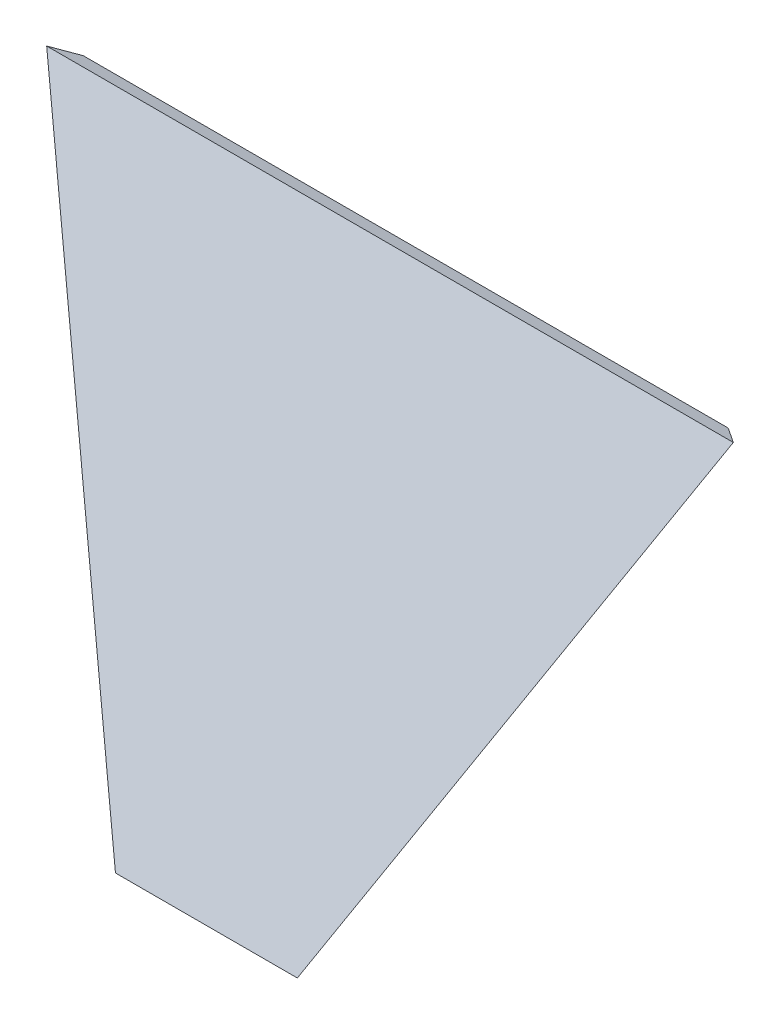
ISO-10303-21;
HEADER;
FILE_DESCRIPTION(('STEP AP214'),'2;1');
FILE_NAME('part.step','',(''),(''),'','','');
FILE_SCHEMA(('AUTOMOTIVE_DESIGN { 1 0 10303 214 1 1 1 1 }'));
ENDSEC;
DATA;
#1=APPLICATION_CONTEXT('core data for automotive mechanical design processes');
#2=APPLICATION_PROTOCOL_DEFINITION('international standard','automotive_design',2000,#1);
#3=PRODUCT_CONTEXT('',#1,'mechanical');
#4=PRODUCT('Part','Part','',(#3));
#5=PRODUCT_RELATED_PRODUCT_CATEGORY('part','',(#4));
#6=PRODUCT_DEFINITION_FORMATION('','',#4);
#7=PRODUCT_DEFINITION_CONTEXT('part definition',#1,'design');
#8=PRODUCT_DEFINITION('design','',#6,#7);
#9=PRODUCT_DEFINITION_SHAPE('','',#8);
#10=(LENGTH_UNIT() NAMED_UNIT(*) SI_UNIT(.MILLI.,.METRE.));
#11=(NAMED_UNIT(*) PLANE_ANGLE_UNIT() SI_UNIT($,.RADIAN.));
#12=(NAMED_UNIT(*) SI_UNIT($,.STERADIAN.) SOLID_ANGLE_UNIT());
#13=UNCERTAINTY_MEASURE_WITH_UNIT(LENGTH_MEASURE(1.E-05),#10,'distance_accuracy_value','');
#14=(GEOMETRIC_REPRESENTATION_CONTEXT(3) GLOBAL_UNCERTAINTY_ASSIGNED_CONTEXT((#13)) GLOBAL_UNIT_ASSIGNED_CONTEXT((#10,
#11,#12)) REPRESENTATION_CONTEXT('',''));
#15=CARTESIAN_POINT('',(0.,0.,0.));
#16=DIRECTION('',(0.,0.,1.));
#17=DIRECTION('',(1.,0.,0.));
#18=AXIS2_PLACEMENT_3D('',#15,#16,#17);
#19=CARTESIAN_POINT('',(-202.216329949319,361.646186737307,-51.3842000000199));
#20=DIRECTION('',(0.599439623726799,0.526033966837793,0.60329130877145));
#21=DIRECTION('',(0.709367617412239,0.,-0.70483869315389));
#22=AXIS2_PLACEMENT_3D('',#19,#20,#21);
#23=PLANE('',#22);
#24=DIRECTION('',(0.780329870048946,-0.216253771888639,-0.58678752547522));
#25=VECTOR('',#24,1.);
#26=CARTESIAN_POINT('',(-34.9249999999667,31.4461867373069,70.3072000000031));
#27=LINE('',#26,#25);
#28=CARTESIAN_POINT('',(-21.058902080191,27.6034580508596,59.8802592937195));
#29=VERTEX_POINT('',#28);
#30=CARTESIAN_POINT('',(-34.9249999999667,31.4461867373069,70.3072000000032));
#31=VERTEX_POINT('',#30);
#32=EDGE_CURVE('E89',#29,#31,#27,.F.);
#33=ORIENTED_EDGE('',*,*,#32,.T.);
#34=DIRECTION('',(0.429337284686035,-0.847426889643649,0.312309402175653));
#35=VECTOR('',#34,1.);
#36=CARTESIAN_POINT('',(-202.216329949319,361.646186737307,-51.3842000000199));
#37=LINE('',#36,#35);
#38=CARTESIAN_POINT('',(-202.216329949319,361.646186737307,-51.3842000000199));
#39=VERTEX_POINT('',#38);
#40=EDGE_CURVE('E95',#39,#31,#37,.T.);
#41=ORIENTED_EDGE('',*,*,#40,.F.);
#42=DIRECTION('',(0.780329870048946,-0.216253771888639,-0.58678752547522));
#43=VECTOR('',#42,1.);
#44=CARTESIAN_POINT('',(74.9125332436644,284.845125718158,-259.777811615287));
#45=LINE('',#44,#43);
#46=CARTESIAN_POINT('',(-188.350232029543,357.80345805086,-61.8111407063036));
#47=VERTEX_POINT('',#46);
#48=EDGE_CURVE('E90',#39,#47,#45,.T.);
#49=ORIENTED_EDGE('',*,*,#48,.T.);
#50=DIRECTION('',(-0.429337284686035,0.847426889643649,-0.312309402175653));
#51=VECTOR('',#50,1.);
#52=CARTESIAN_POINT('',(-107.01379829253,197.261423815776,-2.64522639703944));
#53=LINE('',#52,#51);
#54=EDGE_CURVE('E105',#29,#47,#53,.T.);
#55=ORIENTED_EDGE('',*,*,#54,.F.);
#56=EDGE_LOOP('',(#33,#41,#49,#55));
#57=FACE_BOUND('',#56,.T.);
#58=ADVANCED_FACE('F41',(#57),#23,.F.);
#59=CARTESIAN_POINT('',(252.903016686641,361.646186737307,-51.3842000000199));
#60=DIRECTION('',(-0.599439623726809,0.526033966837768,0.603291308771462));
#61=DIRECTION('',(0.70936761741224,0.,0.704838693153889));
#62=AXIS2_PLACEMENT_3D('',#59,#60,#61);
#63=PLANE('',#62);
#64=DIRECTION('',(0.780329870048942,0.216253771888641,0.586787525475225));
#65=VECTOR('',#64,1.);
#66=CARTESIAN_POINT('',(12.2151255595458,11.1057079121775,15.1149176525535));
#67=LINE('',#66,#65);
#68=CARTESIAN_POINT('',(85.6116867373077,31.4461867373069,70.3072000000032));
#69=VERTEX_POINT('',#68);
#70=CARTESIAN_POINT('',(71.7455888175322,27.6034580508597,59.8802592937195));
#71=VERTEX_POINT('',#70);
#72=EDGE_CURVE('E115',#69,#71,#67,.F.);
#73=ORIENTED_EDGE('',*,*,#72,.T.);
#74=DIRECTION('',(-0.429337284685995,-0.847426889643666,0.31230940217566));
#75=VECTOR('',#74,1.);
#76=CARTESIAN_POINT('',(241.59286358523,362.848387631368,-63.6703912924742));
#77=LINE('',#76,#75);
#78=CARTESIAN_POINT('',(239.036918766865,357.80345805086,-61.8111407063036));
#79=VERTEX_POINT('',#78);
#80=EDGE_CURVE('E87',#79,#71,#77,.T.);
#81=ORIENTED_EDGE('',*,*,#80,.F.);
#82=DIRECTION('',(0.780329870048942,0.216253771888641,0.586787525475225));
#83=VECTOR('',#82,1.);
#84=CARTESIAN_POINT('',(252.903016686641,361.646186737307,-51.3842000000199));
#85=LINE('',#84,#83);
#86=CARTESIAN_POINT('',(252.903016686641,361.646186737307,-51.3842000000199));
#87=VERTEX_POINT('',#86);
#88=EDGE_CURVE('E63',#79,#87,#85,.T.);
#89=ORIENTED_EDGE('',*,*,#88,.T.);
#90=CARTESIAN_POINT('',(252.903016686641,361.646186737307,-51.3842000000199));
#91=CARTESIAN_POINT('',(197.139240036863,251.57952007064,-10.8204000000122));
#92=CARTESIAN_POINT('',(141.375463387085,141.512853403974,29.7433999999955));
#93=CARTESIAN_POINT('',(85.6116867373077,31.4461867373069,70.3072000000032));
#94=B_SPLINE_CURVE_WITH_KNOTS('',3,(#90,#91,#92,#93),.UNSPECIFIED.,.F.,.F.,(4,4),(0.,1.),.UNSPECIFIED.);
#95=EDGE_CURVE('E11',#69,#87,#94,.F.);
#96=ORIENTED_EDGE('',*,*,#95,.F.);
#97=EDGE_LOOP('',(#73,#81,#89,#96));
#98=FACE_BOUND('',#97,.T.);
#99=ADVANCED_FACE('F43',(#98),#63,.F.);
#100=CARTESIAN_POINT('',(252.903016686641,361.646186737307,-51.3842000000199));
#101=DIRECTION('',(0.,0.345802356485694,0.938307375143637));
#102=DIRECTION('',(-1.,0.,0.));
#103=AXIS2_PLACEMENT_3D('',#100,#101,#102);
#104=PLANE('',#103);
#105=CARTESIAN_POINT('',(252.903016686641,361.646186737307,-51.3842000000199));
#106=CARTESIAN_POINT('',(101.196567807988,361.646186737307,-51.3842000000199));
#107=CARTESIAN_POINT('',(-50.5098810706657,361.646186737307,-51.3842000000199));
#108=CARTESIAN_POINT('',(-202.216329949319,361.646186737307,-51.3842000000199));
#109=B_SPLINE_CURVE_WITH_KNOTS('',3,(#105,#106,#107,#108),.UNSPECIFIED.,.F.,.F.,(4,4),(0.,1.),.UNSPECIFIED.);
#110=EDGE_CURVE('E85',#87,#39,#109,.T.);
#111=ORIENTED_EDGE('',*,*,#110,.T.);
#112=ORIENTED_EDGE('',*,*,#40,.T.);
#113=CARTESIAN_POINT('',(85.6116867373077,31.4461867373069,70.3072000000032));
#114=CARTESIAN_POINT('',(45.4327911582163,31.4461867373069,70.3072000000032));
#115=CARTESIAN_POINT('',(5.25389557912479,31.4461867373069,70.3072000000032));
#116=CARTESIAN_POINT('',(-34.9249999999667,31.4461867373069,70.3072000000032));
#117=B_SPLINE_CURVE_WITH_KNOTS('',3,(#113,#114,#115,#116),.UNSPECIFIED.,.F.,.F.,(4,4),(0.,1.),.UNSPECIFIED.);
#118=EDGE_CURVE('E50',#31,#69,#117,.F.);
#119=ORIENTED_EDGE('',*,*,#118,.T.);
#120=ORIENTED_EDGE('',*,*,#95,.T.);
#121=EDGE_LOOP('',(#111,#112,#119,#120));
#122=FACE_BOUND('',#121,.T.);
#123=ADVANCED_FACE('F84',(#122),#104,.T.);
#124=CARTESIAN_POINT('',(252.903016686641,357.80345805086,-61.8111407063036));
#125=DIRECTION('',(0.,0.345802356485694,0.938307375143637));
#126=DIRECTION('',(-1.,0.,0.));
#127=AXIS2_PLACEMENT_3D('',#124,#125,#126);
#128=PLANE('',#127);
#129=DIRECTION('',(-1.,0.,0.));
#130=VECTOR('',#129,1.);
#131=CARTESIAN_POINT('',(252.903016686641,357.80345805086,-61.8111407063036));
#132=LINE('',#131,#130);
#133=EDGE_CURVE('E107',#79,#47,#132,.T.);
#134=ORIENTED_EDGE('',*,*,#133,.F.);
#135=ORIENTED_EDGE('',*,*,#80,.T.);
#136=DIRECTION('',(-1.,0.,0.));
#137=VECTOR('',#136,1.);
#138=CARTESIAN_POINT('',(252.903016686641,27.6034580508597,59.8802592937195));
#139=LINE('',#138,#137);
#140=EDGE_CURVE('E98',#29,#71,#139,.F.);
#141=ORIENTED_EDGE('',*,*,#140,.F.);
#142=ORIENTED_EDGE('',*,*,#54,.T.);
#143=EDGE_LOOP('',(#134,#135,#141,#142));
#144=FACE_BOUND('',#143,.T.);
#145=ADVANCED_FACE('F136',(#144),#128,.F.);
#146=CARTESIAN_POINT('',(-34.9249999999667,31.4461867373069,70.3072000000032));
#147=DIRECTION('',(0.,0.938307375143637,-0.345802356485694));
#148=DIRECTION('',(-1.,0.,0.));
#149=AXIS2_PLACEMENT_3D('',#146,#147,#148);
#150=PLANE('',#149);
#151=ORIENTED_EDGE('',*,*,#72,.F.);
#152=ORIENTED_EDGE('',*,*,#118,.F.);
#153=ORIENTED_EDGE('',*,*,#32,.F.);
#154=ORIENTED_EDGE('',*,*,#140,.T.);
#155=EDGE_LOOP('',(#151,#152,#153,#154));
#156=FACE_BOUND('',#155,.T.);
#157=ADVANCED_FACE('F134',(#156),#150,.F.);
#158=CARTESIAN_POINT('',(252.903016686641,361.646186737307,-51.3842000000199));
#159=DIRECTION('',(0.,0.938307375143637,-0.345802356485694));
#160=DIRECTION('',(-1.,0.,0.));
#161=AXIS2_PLACEMENT_3D('',#158,#159,#160);
#162=PLANE('',#161);
#163=ORIENTED_EDGE('',*,*,#88,.F.);
#164=ORIENTED_EDGE('',*,*,#133,.T.);
#165=ORIENTED_EDGE('',*,*,#48,.F.);
#166=ORIENTED_EDGE('',*,*,#110,.F.);
#167=EDGE_LOOP('',(#163,#164,#165,#166));
#168=FACE_BOUND('',#167,.T.);
#169=ADVANCED_FACE('F92',(#168),#162,.T.);
#170=CLOSED_SHELL('',(#58,#99,#123,#145,#157,#169));
#171=MANIFOLD_SOLID_BREP('B2',#170);
#172=ADVANCED_BREP_SHAPE_REPRESENTATION('',(#18,#171),#14);
#173=SHAPE_DEFINITION_REPRESENTATION(#9,#172);
ENDSEC;
END-ISO-10303-21;
